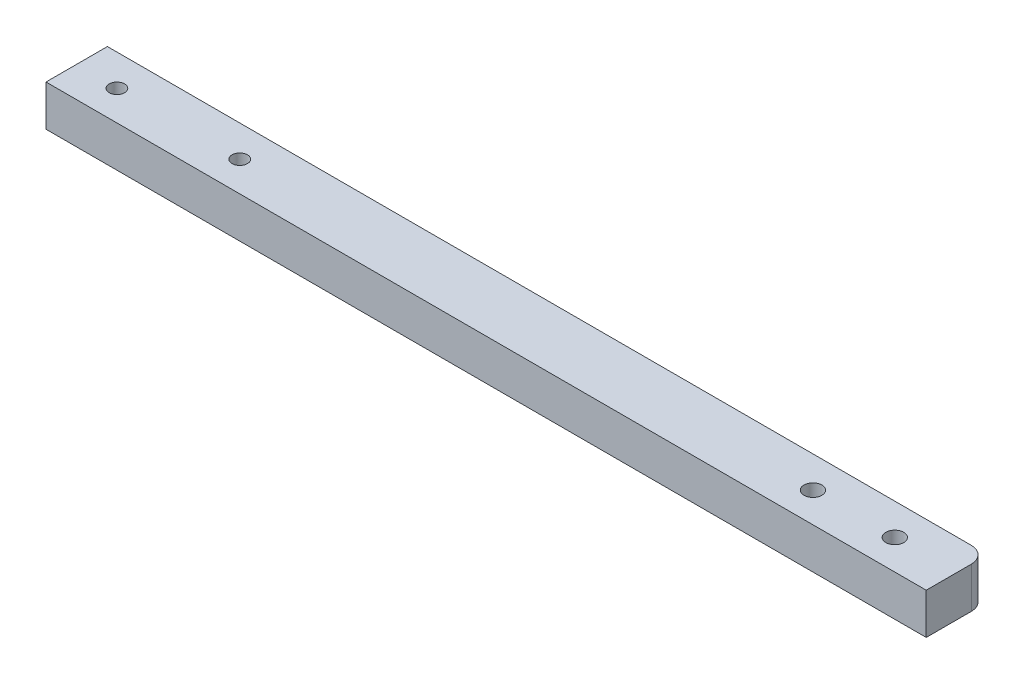
ISO-10303-21;
HEADER;
FILE_DESCRIPTION(('STEP AP214'),'2;1');
FILE_NAME('part.step','',(''),(''),'','','');
FILE_SCHEMA(('AUTOMOTIVE_DESIGN { 1 0 10303 214 1 1 1 1 }'));
ENDSEC;
DATA;
#1=APPLICATION_CONTEXT('core data for automotive mechanical design processes');
#2=APPLICATION_PROTOCOL_DEFINITION('international standard','automotive_design',2000,#1);
#3=PRODUCT_CONTEXT('',#1,'mechanical');
#4=PRODUCT('Part','Part','',(#3));
#5=PRODUCT_RELATED_PRODUCT_CATEGORY('part','',(#4));
#6=PRODUCT_DEFINITION_FORMATION('','',#4);
#7=PRODUCT_DEFINITION_CONTEXT('part definition',#1,'design');
#8=PRODUCT_DEFINITION('design','',#6,#7);
#9=PRODUCT_DEFINITION_SHAPE('','',#8);
#10=(LENGTH_UNIT() NAMED_UNIT(*) SI_UNIT(.MILLI.,.METRE.));
#11=(NAMED_UNIT(*) PLANE_ANGLE_UNIT() SI_UNIT($,.RADIAN.));
#12=(NAMED_UNIT(*) SI_UNIT($,.STERADIAN.) SOLID_ANGLE_UNIT());
#13=UNCERTAINTY_MEASURE_WITH_UNIT(LENGTH_MEASURE(1.E-05),#10,'distance_accuracy_value','');
#14=(GEOMETRIC_REPRESENTATION_CONTEXT(3) GLOBAL_UNCERTAINTY_ASSIGNED_CONTEXT((#13)) GLOBAL_UNIT_ASSIGNED_CONTEXT((#10,
#11,#12)) REPRESENTATION_CONTEXT('',''));
#15=CARTESIAN_POINT('',(0.,0.,0.));
#16=DIRECTION('',(0.,0.,1.));
#17=DIRECTION('',(1.,0.,0.));
#18=AXIS2_PLACEMENT_3D('',#15,#16,#17);
#19=CARTESIAN_POINT('',(0.,6.34999999999999,0.));
#20=DIRECTION('',(1.,0.,0.));
#21=DIRECTION('',(0.,0.,-1.));
#22=AXIS2_PLACEMENT_3D('',#19,#20,#21);
#23=PLANE('',#22);
#24=DIRECTION('',(0.,0.,1.));
#25=VECTOR('',#24,1.);
#26=CARTESIAN_POINT('',(0.,0.,0.));
#27=LINE('',#26,#25);
#28=CARTESIAN_POINT('',(0.,0.,-304.8));
#29=VERTEX_POINT('',#28);
#30=CARTESIAN_POINT('',(0.,1.80411241501588E-13,-295.275));
#31=VERTEX_POINT('',#30);
#32=EDGE_CURVE('E120',#29,#31,#27,.T.);
#33=ORIENTED_EDGE('',*,*,#32,.T.);
#34=DIRECTION('',(0.,1.,0.));
#35=VECTOR('',#34,1.);
#36=CARTESIAN_POINT('',(0.,1.80411241501588E-13,-295.275));
#37=LINE('',#36,#35);
#38=CARTESIAN_POINT('',(0.,6.35000000000017,-295.275));
#39=VERTEX_POINT('',#38);
#40=EDGE_CURVE('E110',#31,#39,#37,.T.);
#41=ORIENTED_EDGE('',*,*,#40,.T.);
#42=DIRECTION('',(0.,0.,1.));
#43=VECTOR('',#42,1.);
#44=CARTESIAN_POINT('',(0.,6.34999999999999,0.));
#45=LINE('',#44,#43);
#46=CARTESIAN_POINT('',(0.,6.35000000000001,-304.8));
#47=VERTEX_POINT('',#46);
#48=EDGE_CURVE('E122',#47,#39,#45,.T.);
#49=ORIENTED_EDGE('',*,*,#48,.F.);
#50=DIRECTION('',(0.,-1.,0.));
#51=VECTOR('',#50,1.);
#52=CARTESIAN_POINT('',(0.,6.35000000000001,-304.8));
#53=LINE('',#52,#51);
#54=EDGE_CURVE('E128',#47,#29,#53,.T.);
#55=ORIENTED_EDGE('',*,*,#54,.T.);
#56=EDGE_LOOP('',(#33,#41,#49,#55));
#57=FACE_BOUND('',#56,.T.);
#58=ADVANCED_FACE('F46',(#57),#23,.F.);
#59=CARTESIAN_POINT('',(0.,6.35000000000001,-304.8));
#60=DIRECTION('',(0.,0.,1.));
#61=DIRECTION('',(1.,0.,0.));
#62=AXIS2_PLACEMENT_3D('',#59,#60,#61);
#63=PLANE('',#62);
#64=DIRECTION('',(-1.,0.,0.));
#65=VECTOR('',#64,1.);
#66=CARTESIAN_POINT('',(0.,6.35000000000001,-304.8));
#67=LINE('',#66,#65);
#68=CARTESIAN_POINT('',(133.985,6.34999999999999,-304.8));
#69=VERTEX_POINT('',#68);
#70=EDGE_CURVE('E125',#69,#47,#67,.T.);
#71=ORIENTED_EDGE('',*,*,#70,.F.);
#72=DIRECTION('',(0.,1.,0.));
#73=VECTOR('',#72,1.);
#74=CARTESIAN_POINT('',(133.985,6.34999999999999,-304.8));
#75=LINE('',#74,#73);
#76=CARTESIAN_POINT('',(133.985,0.,-304.8));
#77=VERTEX_POINT('',#76);
#78=EDGE_CURVE('E54',#69,#77,#75,.F.);
#79=ORIENTED_EDGE('',*,*,#78,.T.);
#80=DIRECTION('',(-1.,0.,0.));
#81=VECTOR('',#80,1.);
#82=CARTESIAN_POINT('',(0.,0.,-304.8));
#83=LINE('',#82,#81);
#84=EDGE_CURVE('E126',#77,#29,#83,.T.);
#85=ORIENTED_EDGE('',*,*,#84,.T.);
#86=ORIENTED_EDGE('',*,*,#54,.F.);
#87=EDGE_LOOP('',(#71,#79,#85,#86));
#88=FACE_BOUND('',#87,.T.);
#89=ADVANCED_FACE('F149',(#88),#63,.F.);
#90=CARTESIAN_POINT('',(0.,6.34999999999999,0.));
#91=DIRECTION('',(0.,-1.,0.));
#92=DIRECTION('',(0.,0.,-1.));
#93=AXIS2_PLACEMENT_3D('',#90,#91,#92);
#94=PLANE('',#93);
#95=CARTESIAN_POINT('',(6.35,6.35000000000017,-299.926763769509));
#96=DIRECTION('',(0.,1.,0.));
#97=DIRECTION('',(0.,0.,1.));
#98=AXIS2_PLACEMENT_3D('',#95,#96,#97);
#99=CIRCLE('',#98,1.19062500000001);
#100=CARTESIAN_POINT('',(6.35,6.35000000000017,-298.736138769509));
#101=VERTEX_POINT('',#100);
#102=EDGE_CURVE('E187',#101,#101,#99,.T.);
#103=ORIENTED_EDGE('',*,*,#102,.F.);
#104=EDGE_LOOP('',(#103));
#105=FACE_BOUND('',#104,.T.);
#106=CARTESIAN_POINT('',(25.4,6.35000000000001,-299.926763769509));
#107=DIRECTION('',(0.,1.,0.));
#108=DIRECTION('',(0.,0.,1.));
#109=AXIS2_PLACEMENT_3D('',#106,#107,#108);
#110=CIRCLE('',#109,1.19062500000001);
#111=CARTESIAN_POINT('',(25.4,6.35000000000001,-298.736138769509));
#112=VERTEX_POINT('',#111);
#113=EDGE_CURVE('E183',#112,#112,#110,.T.);
#114=ORIENTED_EDGE('',*,*,#113,.F.);
#115=EDGE_LOOP('',(#114));
#116=FACE_BOUND('',#115,.T.);
#117=CARTESIAN_POINT('',(114.3,6.35000000000017,-299.926763769509));
#118=DIRECTION('',(0.,1.,0.));
#119=DIRECTION('',(0.,0.,1.));
#120=AXIS2_PLACEMENT_3D('',#117,#118,#119);
#121=CIRCLE('',#120,1.38906249999997);
#122=CARTESIAN_POINT('',(114.3,6.35000000000017,-298.537701269509));
#123=VERTEX_POINT('',#122);
#124=EDGE_CURVE('E190',#123,#123,#121,.T.);
#125=ORIENTED_EDGE('',*,*,#124,.F.);
#126=EDGE_LOOP('',(#125));
#127=FACE_BOUND('',#126,.T.);
#128=CARTESIAN_POINT('',(127.,6.34999999999999,-299.926763769509));
#129=DIRECTION('',(0.,1.,0.));
#130=DIRECTION('',(0.,0.,1.));
#131=AXIS2_PLACEMENT_3D('',#128,#129,#130);
#132=CIRCLE('',#131,1.3890625);
#133=CARTESIAN_POINT('',(127.,6.34999999999999,-298.537701269509));
#134=VERTEX_POINT('',#133);
#135=EDGE_CURVE('E198',#134,#134,#132,.T.);
#136=ORIENTED_EDGE('',*,*,#135,.F.);
#137=EDGE_LOOP('',(#136));
#138=FACE_BOUND('',#137,.T.);
#139=DIRECTION('',(0.,0.,1.));
#140=VECTOR('',#139,1.);
#141=CARTESIAN_POINT('',(136.525,6.35000000000017,-304.8));
#142=LINE('',#141,#140);
#143=CARTESIAN_POINT('',(136.525,6.35000000000001,-302.26));
#144=VERTEX_POINT('',#143);
#145=CARTESIAN_POINT('',(136.525,6.34999999999999,-295.275));
#146=VERTEX_POINT('',#145);
#147=EDGE_CURVE('E107',#144,#146,#142,.T.);
#148=ORIENTED_EDGE('',*,*,#147,.F.);
#149=CARTESIAN_POINT('',(133.985,6.34999999999999,-302.26));
#150=DIRECTION('',(0.,-1.,0.));
#151=DIRECTION('',(0.,0.,-1.));
#152=AXIS2_PLACEMENT_3D('',#149,#150,#151);
#153=CIRCLE('',#152,2.54);
#154=EDGE_CURVE('E68',#144,#69,#153,.F.);
#155=ORIENTED_EDGE('',*,*,#154,.T.);
#156=ORIENTED_EDGE('',*,*,#70,.T.);
#157=ORIENTED_EDGE('',*,*,#48,.T.);
#158=DIRECTION('',(-1.,0.,0.));
#159=VECTOR('',#158,1.);
#160=CARTESIAN_POINT('',(136.525,6.34999999999999,-295.275));
#161=LINE('',#160,#159);
#162=EDGE_CURVE('E102',#146,#39,#161,.T.);
#163=ORIENTED_EDGE('',*,*,#162,.F.);
#164=EDGE_LOOP('',(#148,#155,#156,#157,#163));
#165=FACE_BOUND('',#164,.T.);
#166=ADVANCED_FACE('F136',(#105,#116,#127,#138,#165),#94,.F.);
#167=CARTESIAN_POINT('',(0.,0.,0.));
#168=DIRECTION('',(0.,-1.,0.));
#169=DIRECTION('',(0.,0.,-1.));
#170=AXIS2_PLACEMENT_3D('',#167,#168,#169);
#171=PLANE('',#170);
#172=CARTESIAN_POINT('',(6.35000000000004,1.80411241501588E-13,-299.926763769509));
#173=DIRECTION('',(0.,1.,0.));
#174=DIRECTION('',(0.,0.,1.));
#175=AXIS2_PLACEMENT_3D('',#172,#173,#174);
#176=CIRCLE('',#175,1.19062500000001);
#177=CARTESIAN_POINT('',(6.35000000000004,1.80411241501588E-13,-298.736138769509));
#178=VERTEX_POINT('',#177);
#179=EDGE_CURVE('E118',#178,#178,#176,.T.);
#180=ORIENTED_EDGE('',*,*,#179,.T.);
#181=EDGE_LOOP('',(#180));
#182=FACE_BOUND('',#181,.T.);
#183=CARTESIAN_POINT('',(25.4,0.,-299.926763769509));
#184=DIRECTION('',(0.,1.,0.));
#185=DIRECTION('',(0.,0.,1.));
#186=AXIS2_PLACEMENT_3D('',#183,#184,#185);
#187=CIRCLE('',#186,1.19062500000001);
#188=CARTESIAN_POINT('',(25.4,0.,-298.736138769509));
#189=VERTEX_POINT('',#188);
#190=EDGE_CURVE('E180',#189,#189,#187,.T.);
#191=ORIENTED_EDGE('',*,*,#190,.T.);
#192=EDGE_LOOP('',(#191));
#193=FACE_BOUND('',#192,.T.);
#194=CARTESIAN_POINT('',(114.3,1.80411241501588E-13,-299.926763769509));
#195=DIRECTION('',(0.,1.,0.));
#196=DIRECTION('',(0.,0.,1.));
#197=AXIS2_PLACEMENT_3D('',#194,#195,#196);
#198=CIRCLE('',#197,1.38906249999997);
#199=CARTESIAN_POINT('',(114.3,1.80411241501588E-13,-298.537701269509));
#200=VERTEX_POINT('',#199);
#201=EDGE_CURVE('E185',#200,#200,#198,.T.);
#202=ORIENTED_EDGE('',*,*,#201,.T.);
#203=EDGE_LOOP('',(#202));
#204=FACE_BOUND('',#203,.T.);
#205=CARTESIAN_POINT('',(127.,0.,-299.926763769509));
#206=DIRECTION('',(0.,1.,0.));
#207=DIRECTION('',(0.,0.,1.));
#208=AXIS2_PLACEMENT_3D('',#205,#206,#207);
#209=CIRCLE('',#208,1.3890625);
#210=CARTESIAN_POINT('',(127.,0.,-298.537701269509));
#211=VERTEX_POINT('',#210);
#212=EDGE_CURVE('E196',#211,#211,#209,.T.);
#213=ORIENTED_EDGE('',*,*,#212,.T.);
#214=EDGE_LOOP('',(#213));
#215=FACE_BOUND('',#214,.T.);
#216=ORIENTED_EDGE('',*,*,#84,.F.);
#217=CARTESIAN_POINT('',(133.985,0.,-302.26));
#218=DIRECTION('',(0.,-1.,0.));
#219=DIRECTION('',(0.,0.,-1.));
#220=AXIS2_PLACEMENT_3D('',#217,#218,#219);
#221=CIRCLE('',#220,2.54);
#222=CARTESIAN_POINT('',(136.525,0.,-302.26));
#223=VERTEX_POINT('',#222);
#224=EDGE_CURVE('E13',#77,#223,#221,.T.);
#225=ORIENTED_EDGE('',*,*,#224,.T.);
#226=DIRECTION('',(0.,0.,1.));
#227=VECTOR('',#226,1.);
#228=CARTESIAN_POINT('',(136.525,1.80411241501588E-13,-304.8));
#229=LINE('',#228,#227);
#230=CARTESIAN_POINT('',(136.525,0.,-295.275));
#231=VERTEX_POINT('',#230);
#232=EDGE_CURVE('E91',#223,#231,#229,.T.);
#233=ORIENTED_EDGE('',*,*,#232,.T.);
#234=DIRECTION('',(-1.,0.,0.));
#235=VECTOR('',#234,1.);
#236=CARTESIAN_POINT('',(136.525,0.,-295.275));
#237=LINE('',#236,#235);
#238=EDGE_CURVE('E96',#231,#31,#237,.T.);
#239=ORIENTED_EDGE('',*,*,#238,.T.);
#240=ORIENTED_EDGE('',*,*,#32,.F.);
#241=EDGE_LOOP('',(#216,#225,#233,#239,#240));
#242=FACE_BOUND('',#241,.T.);
#243=ADVANCED_FACE('F93',(#182,#193,#204,#215,#242),#171,.T.);
#244=CARTESIAN_POINT('',(136.525,1.80411241501588E-13,-304.8));
#245=DIRECTION('',(-1.,0.,0.));
#246=DIRECTION('',(0.,0.,1.));
#247=AXIS2_PLACEMENT_3D('',#244,#245,#246);
#248=PLANE('',#247);
#249=ORIENTED_EDGE('',*,*,#232,.F.);
#250=DIRECTION('',(0.,1.,0.));
#251=VECTOR('',#250,1.);
#252=CARTESIAN_POINT('',(136.525,0.,-302.26));
#253=LINE('',#252,#251);
#254=EDGE_CURVE('E133',#223,#144,#253,.T.);
#255=ORIENTED_EDGE('',*,*,#254,.T.);
#256=ORIENTED_EDGE('',*,*,#147,.T.);
#257=DIRECTION('',(0.,1.,0.));
#258=VECTOR('',#257,1.);
#259=CARTESIAN_POINT('',(136.525,0.,-295.275));
#260=LINE('',#259,#258);
#261=EDGE_CURVE('E105',#231,#146,#260,.T.);
#262=ORIENTED_EDGE('',*,*,#261,.F.);
#263=EDGE_LOOP('',(#249,#255,#256,#262));
#264=FACE_BOUND('',#263,.T.);
#265=ADVANCED_FACE('F106',(#264),#248,.F.);
#266=CARTESIAN_POINT('',(136.525,0.,-295.275));
#267=DIRECTION('',(0.,0.,-1.));
#268=DIRECTION('',(-1.,0.,0.));
#269=AXIS2_PLACEMENT_3D('',#266,#267,#268);
#270=PLANE('',#269);
#271=ORIENTED_EDGE('',*,*,#162,.T.);
#272=ORIENTED_EDGE('',*,*,#40,.F.);
#273=ORIENTED_EDGE('',*,*,#238,.F.);
#274=ORIENTED_EDGE('',*,*,#261,.T.);
#275=EDGE_LOOP('',(#271,#272,#273,#274));
#276=FACE_BOUND('',#275,.T.);
#277=ADVANCED_FACE('F112',(#276),#270,.F.);
#278=CARTESIAN_POINT('',(127.,0.,-299.926763769509));
#279=DIRECTION('',(0.,1.,0.));
#280=DIRECTION('',(0.,0.,1.));
#281=AXIS2_PLACEMENT_3D('',#278,#279,#280);
#282=CYLINDRICAL_SURFACE('',#281,1.3890625);
#283=ORIENTED_EDGE('',*,*,#212,.F.);
#284=EDGE_LOOP('',(#283));
#285=FACE_BOUND('',#284,.T.);
#286=ORIENTED_EDGE('',*,*,#135,.T.);
#287=EDGE_LOOP('',(#286));
#288=FACE_BOUND('',#287,.T.);
#289=ADVANCED_FACE('F165',(#285,#288),#282,.F.);
#290=CARTESIAN_POINT('',(114.3,1.80411241501588E-13,-299.926763769509));
#291=DIRECTION('',(0.,1.,0.));
#292=DIRECTION('',(0.,0.,1.));
#293=AXIS2_PLACEMENT_3D('',#290,#291,#292);
#294=CYLINDRICAL_SURFACE('',#293,1.38906249999997);
#295=ORIENTED_EDGE('',*,*,#201,.F.);
#296=EDGE_LOOP('',(#295));
#297=FACE_BOUND('',#296,.T.);
#298=ORIENTED_EDGE('',*,*,#124,.T.);
#299=EDGE_LOOP('',(#298));
#300=FACE_BOUND('',#299,.T.);
#301=ADVANCED_FACE('F168',(#297,#300),#294,.F.);
#302=CARTESIAN_POINT('',(25.4,0.,-299.926763769509));
#303=DIRECTION('',(0.,1.,0.));
#304=DIRECTION('',(0.,0.,1.));
#305=AXIS2_PLACEMENT_3D('',#302,#303,#304);
#306=CYLINDRICAL_SURFACE('',#305,1.19062500000001);
#307=ORIENTED_EDGE('',*,*,#190,.F.);
#308=EDGE_LOOP('',(#307));
#309=FACE_BOUND('',#308,.T.);
#310=ORIENTED_EDGE('',*,*,#113,.T.);
#311=EDGE_LOOP('',(#310));
#312=FACE_BOUND('',#311,.T.);
#313=ADVANCED_FACE('F145',(#309,#312),#306,.F.);
#314=CARTESIAN_POINT('',(6.35000000000004,1.80411241501588E-13,-299.926763769509));
#315=DIRECTION('',(0.,1.,0.));
#316=DIRECTION('',(0.,0.,1.));
#317=AXIS2_PLACEMENT_3D('',#314,#315,#316);
#318=CYLINDRICAL_SURFACE('',#317,1.19062500000001);
#319=ORIENTED_EDGE('',*,*,#179,.F.);
#320=EDGE_LOOP('',(#319));
#321=FACE_BOUND('',#320,.T.);
#322=ORIENTED_EDGE('',*,*,#102,.T.);
#323=EDGE_LOOP('',(#322));
#324=FACE_BOUND('',#323,.T.);
#325=ADVANCED_FACE('F141',(#321,#324),#318,.F.);
#326=CARTESIAN_POINT('',(133.985,0.,-302.26));
#327=DIRECTION('',(0.,1.,0.));
#328=DIRECTION('',(0.,0.,1.));
#329=AXIS2_PLACEMENT_3D('',#326,#327,#328);
#330=CYLINDRICAL_SURFACE('',#329,2.54);
#331=ORIENTED_EDGE('',*,*,#224,.F.);
#332=ORIENTED_EDGE('',*,*,#78,.F.);
#333=ORIENTED_EDGE('',*,*,#154,.F.);
#334=ORIENTED_EDGE('',*,*,#254,.F.);
#335=EDGE_LOOP('',(#331,#332,#333,#334));
#336=FACE_BOUND('',#335,.T.);
#337=ADVANCED_FACE('F48',(#336),#330,.T.);
#338=CLOSED_SHELL('',(#58,#89,#166,#243,#265,#277,#289,#301,#313,#325,#337));
#339=MANIFOLD_SOLID_BREP('B2',#338);
#340=ADVANCED_BREP_SHAPE_REPRESENTATION('',(#18,#339),#14);
#341=SHAPE_DEFINITION_REPRESENTATION(#9,#340);
ENDSEC;
END-ISO-10303-21;
